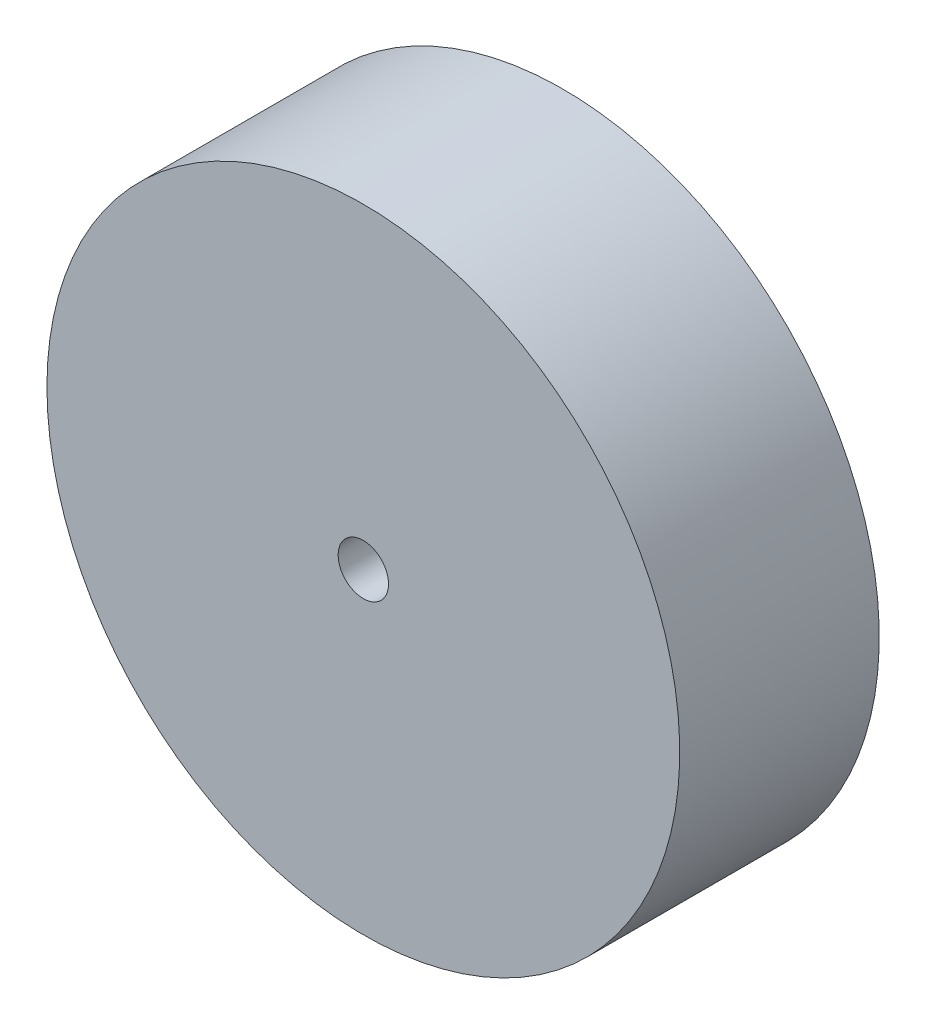
ISO-10303-21;
HEADER;
FILE_DESCRIPTION(('STEP AP214'),'2;1');
FILE_NAME('part.step','',(''),(''),'','','');
FILE_SCHEMA(('AUTOMOTIVE_DESIGN { 1 0 10303 214 1 1 1 1 }'));
ENDSEC;
DATA;
#1=APPLICATION_CONTEXT('core data for automotive mechanical design processes');
#2=APPLICATION_PROTOCOL_DEFINITION('international standard','automotive_design',2000,#1);
#3=PRODUCT_CONTEXT('',#1,'mechanical');
#4=PRODUCT('Part','Part','',(#3));
#5=PRODUCT_RELATED_PRODUCT_CATEGORY('part','',(#4));
#6=PRODUCT_DEFINITION_FORMATION('','',#4);
#7=PRODUCT_DEFINITION_CONTEXT('part definition',#1,'design');
#8=PRODUCT_DEFINITION('design','',#6,#7);
#9=PRODUCT_DEFINITION_SHAPE('','',#8);
#10=(LENGTH_UNIT() NAMED_UNIT(*) SI_UNIT(.MILLI.,.METRE.));
#11=(NAMED_UNIT(*) PLANE_ANGLE_UNIT() SI_UNIT($,.RADIAN.));
#12=(NAMED_UNIT(*) SI_UNIT($,.STERADIAN.) SOLID_ANGLE_UNIT());
#13=UNCERTAINTY_MEASURE_WITH_UNIT(LENGTH_MEASURE(1.E-05),#10,'distance_accuracy_value','');
#14=(GEOMETRIC_REPRESENTATION_CONTEXT(3) GLOBAL_UNCERTAINTY_ASSIGNED_CONTEXT((#13)) GLOBAL_UNIT_ASSIGNED_CONTEXT((#10,
#11,#12)) REPRESENTATION_CONTEXT('',''));
#15=CARTESIAN_POINT('',(0.,0.,0.));
#16=DIRECTION('',(0.,0.,1.));
#17=DIRECTION('',(1.,0.,0.));
#18=AXIS2_PLACEMENT_3D('',#15,#16,#17);
#19=CARTESIAN_POINT('',(0.,0.,19.8));
#20=DIRECTION('',(0.,0.,1.));
#21=DIRECTION('',(1.,0.,0.));
#22=AXIS2_PLACEMENT_3D('',#19,#20,#21);
#23=PLANE('',#22);
#24=CARTESIAN_POINT('',(0.,0.,19.8));
#25=DIRECTION('',(0.,0.,1.));
#26=DIRECTION('',(1.,0.,0.));
#27=AXIS2_PLACEMENT_3D('',#24,#25,#26);
#28=CIRCLE('',#27,31.4);
#29=CARTESIAN_POINT('',(-31.4,0.,19.8));
#30=VERTEX_POINT('',#29);
#31=EDGE_CURVE('E10',#30,#30,#28,.T.);
#32=ORIENTED_EDGE('',*,*,#31,.T.);
#33=EDGE_LOOP('',(#32));
#34=FACE_BOUND('',#33,.T.);
#35=CARTESIAN_POINT('',(0.,0.,19.8));
#36=DIRECTION('',(0.,0.,1.));
#37=DIRECTION('',(1.,0.,0.));
#38=AXIS2_PLACEMENT_3D('',#35,#36,#37);
#39=CIRCLE('',#38,2.5);
#40=CARTESIAN_POINT('',(-2.5,0.,19.8));
#41=VERTEX_POINT('',#40);
#42=EDGE_CURVE('E46',#41,#41,#39,.T.);
#43=ORIENTED_EDGE('',*,*,#42,.F.);
#44=EDGE_LOOP('',(#43));
#45=FACE_BOUND('',#44,.T.);
#46=ADVANCED_FACE('F34',(#34,#45),#23,.T.);
#47=CARTESIAN_POINT('',(0.,0.,0.));
#48=DIRECTION('',(0.,0.,1.));
#49=DIRECTION('',(1.,0.,0.));
#50=AXIS2_PLACEMENT_3D('',#47,#48,#49);
#51=PLANE('',#50);
#52=CARTESIAN_POINT('',(0.,0.,0.));
#53=DIRECTION('',(0.,0.,1.));
#54=DIRECTION('',(1.,0.,0.));
#55=AXIS2_PLACEMENT_3D('',#52,#53,#54);
#56=CIRCLE('',#55,31.4);
#57=CARTESIAN_POINT('',(-31.4,0.,0.));
#58=VERTEX_POINT('',#57);
#59=EDGE_CURVE('E39',#58,#58,#56,.T.);
#60=ORIENTED_EDGE('',*,*,#59,.F.);
#61=EDGE_LOOP('',(#60));
#62=FACE_BOUND('',#61,.T.);
#63=CARTESIAN_POINT('',(0.,0.,0.));
#64=DIRECTION('',(0.,0.,1.));
#65=DIRECTION('',(1.,0.,0.));
#66=AXIS2_PLACEMENT_3D('',#63,#64,#65);
#67=CIRCLE('',#66,2.5);
#68=CARTESIAN_POINT('',(-2.5,0.,0.));
#69=VERTEX_POINT('',#68);
#70=EDGE_CURVE('E48',#69,#69,#67,.T.);
#71=ORIENTED_EDGE('',*,*,#70,.T.);
#72=EDGE_LOOP('',(#71));
#73=FACE_BOUND('',#72,.T.);
#74=ADVANCED_FACE('F59',(#62,#73),#51,.F.);
#75=CARTESIAN_POINT('',(0.,0.,19.8));
#76=DIRECTION('',(0.,0.,-1.));
#77=DIRECTION('',(-1.,0.,0.));
#78=AXIS2_PLACEMENT_3D('',#75,#76,#77);
#79=CYLINDRICAL_SURFACE('',#78,31.4);
#80=CARTESIAN_POINT('',(-31.4,0.,19.8));
#81=CARTESIAN_POINT('',(-31.4,0.,19.59375));
#82=CARTESIAN_POINT('',(-31.4,0.,19.3875));
#83=CARTESIAN_POINT('',(-31.4,0.,18.975));
#84=CARTESIAN_POINT('',(-31.4,0.,18.76875));
#85=CARTESIAN_POINT('',(-31.4,0.,18.35625));
#86=CARTESIAN_POINT('',(-31.4,0.,18.15));
#87=CARTESIAN_POINT('',(-31.4,0.,17.7375));
#88=CARTESIAN_POINT('',(-31.4,0.,17.53125));
#89=CARTESIAN_POINT('',(-31.4,0.,17.11875));
#90=CARTESIAN_POINT('',(-31.4,0.,16.9125));
#91=CARTESIAN_POINT('',(-31.4,0.,16.5));
#92=CARTESIAN_POINT('',(-31.4,0.,16.29375));
#93=CARTESIAN_POINT('',(-31.4,0.,15.88125));
#94=CARTESIAN_POINT('',(-31.4,0.,15.675));
#95=CARTESIAN_POINT('',(-31.4,0.,15.2625));
#96=CARTESIAN_POINT('',(-31.4,0.,15.05625));
#97=CARTESIAN_POINT('',(-31.4,0.,14.64375));
#98=CARTESIAN_POINT('',(-31.4,0.,14.4375));
#99=CARTESIAN_POINT('',(-31.4,0.,14.025));
#100=CARTESIAN_POINT('',(-31.4,0.,13.81875));
#101=CARTESIAN_POINT('',(-31.4,0.,13.40625));
#102=CARTESIAN_POINT('',(-31.4,0.,13.2));
#103=CARTESIAN_POINT('',(-31.4,0.,12.7875));
#104=CARTESIAN_POINT('',(-31.4,0.,12.58125));
#105=CARTESIAN_POINT('',(-31.4,0.,12.16875));
#106=CARTESIAN_POINT('',(-31.4,0.,11.9625));
#107=CARTESIAN_POINT('',(-31.4,0.,11.55));
#108=CARTESIAN_POINT('',(-31.4,0.,11.34375));
#109=CARTESIAN_POINT('',(-31.4,0.,10.93125));
#110=CARTESIAN_POINT('',(-31.4,0.,10.725));
#111=CARTESIAN_POINT('',(-31.4,0.,10.3125));
#112=CARTESIAN_POINT('',(-31.4,0.,10.10625));
#113=CARTESIAN_POINT('',(-31.4,0.,9.69375));
#114=CARTESIAN_POINT('',(-31.4,0.,9.4875));
#115=CARTESIAN_POINT('',(-31.4,0.,9.075));
#116=CARTESIAN_POINT('',(-31.4,0.,8.86875));
#117=CARTESIAN_POINT('',(-31.4,0.,8.45625));
#118=CARTESIAN_POINT('',(-31.4,0.,8.25));
#119=CARTESIAN_POINT('',(-31.4,0.,7.8375));
#120=CARTESIAN_POINT('',(-31.4,0.,7.63125));
#121=CARTESIAN_POINT('',(-31.4,0.,7.21875));
#122=CARTESIAN_POINT('',(-31.4,0.,7.0125));
#123=CARTESIAN_POINT('',(-31.4,0.,6.6));
#124=CARTESIAN_POINT('',(-31.4,0.,6.39375));
#125=CARTESIAN_POINT('',(-31.4,0.,5.98125));
#126=CARTESIAN_POINT('',(-31.4,0.,5.775));
#127=CARTESIAN_POINT('',(-31.4,0.,5.3625));
#128=CARTESIAN_POINT('',(-31.4,0.,5.15625));
#129=CARTESIAN_POINT('',(-31.4,0.,4.74375));
#130=CARTESIAN_POINT('',(-31.4,0.,4.5375));
#131=CARTESIAN_POINT('',(-31.4,0.,4.125));
#132=CARTESIAN_POINT('',(-31.4,0.,3.91875));
#133=CARTESIAN_POINT('',(-31.4,0.,3.50625));
#134=CARTESIAN_POINT('',(-31.4,0.,3.3));
#135=CARTESIAN_POINT('',(-31.4,0.,2.8875));
#136=CARTESIAN_POINT('',(-31.4,0.,2.68125));
#137=CARTESIAN_POINT('',(-31.4,0.,2.26875));
#138=CARTESIAN_POINT('',(-31.4,0.,2.0625));
#139=CARTESIAN_POINT('',(-31.4,0.,1.65));
#140=CARTESIAN_POINT('',(-31.4,0.,1.44375));
#141=CARTESIAN_POINT('',(-31.4,0.,1.03125));
#142=CARTESIAN_POINT('',(-31.4,0.,0.825));
#143=CARTESIAN_POINT('',(-31.4,0.,0.412500000000001));
#144=CARTESIAN_POINT('',(-31.4,0.,0.206250000000001));
#145=CARTESIAN_POINT('',(-31.4,0.,0.));
#146=B_SPLINE_CURVE_WITH_KNOTS('',3,(#80,#81,#82,#83,#84,#85,#86,#87,#88,#89,#90,#91,#92,#93,
#94,#95,#96,#97,#98,#99,#100,#101,#102,#103,#104,#105,#106,#107,#108,#109,#110,#111,#112,#113,
#114,#115,#116,#117,#118,#119,#120,#121,#122,#123,#124,#125,#126,#127,#128,#129,#130,#131,#132,
#133,#134,#135,#136,#137,#138,#139,#140,#141,#142,#143,#144,#145),.UNSPECIFIED.,.F.,.F.,(4,2,2,
2,2,2,2,2,2,2,2,2,2,2,2,2,2,2,2,2,2,2,2,2,2,2,2,2,2,2,2,2,4),(0.,0.618750000000001,1.2375,
1.85625,2.475,3.09375,3.7125,4.33125,4.95,5.56875,6.1875,6.80625,7.425,8.04375,8.6625,9.28125,
9.9,10.51875,11.1375,11.75625,12.375,12.99375,13.6125,14.23125,14.85,15.46875,16.0875,16.70625,
17.325,17.94375,18.5625,19.18125,19.8),.UNSPECIFIED.);
#147=EDGE_CURVE('BSEAM40',#30,#58,#146,.T.);
#148=ORIENTED_EDGE('',*,*,#31,.F.);
#149=ORIENTED_EDGE('',*,*,#59,.T.);
#150=ORIENTED_EDGE('',*,*,#147,.T.);
#151=ORIENTED_EDGE('',*,*,#147,.F.);
#152=EDGE_LOOP('',(#148,#150,#149,#151));
#153=FACE_BOUND('',#152,.T.);
#154=ADVANCED_FACE('F40',(#153),#79,.T.);
#155=CARTESIAN_POINT('',(0.,0.,19.8));
#156=DIRECTION('',(0.,0.,-1.));
#157=DIRECTION('',(-1.,0.,0.));
#158=AXIS2_PLACEMENT_3D('',#155,#156,#157);
#159=CYLINDRICAL_SURFACE('',#158,2.5);
#160=CARTESIAN_POINT('',(-2.5,0.,19.8));
#161=CARTESIAN_POINT('',(-2.5,0.,19.59375));
#162=CARTESIAN_POINT('',(-2.5,0.,19.3875));
#163=CARTESIAN_POINT('',(-2.5,0.,18.975));
#164=CARTESIAN_POINT('',(-2.5,0.,18.76875));
#165=CARTESIAN_POINT('',(-2.5,0.,18.35625));
#166=CARTESIAN_POINT('',(-2.5,0.,18.15));
#167=CARTESIAN_POINT('',(-2.5,0.,17.7375));
#168=CARTESIAN_POINT('',(-2.5,0.,17.53125));
#169=CARTESIAN_POINT('',(-2.5,0.,17.11875));
#170=CARTESIAN_POINT('',(-2.5,0.,16.9125));
#171=CARTESIAN_POINT('',(-2.5,0.,16.5));
#172=CARTESIAN_POINT('',(-2.5,0.,16.29375));
#173=CARTESIAN_POINT('',(-2.5,0.,15.88125));
#174=CARTESIAN_POINT('',(-2.5,0.,15.675));
#175=CARTESIAN_POINT('',(-2.5,0.,15.2625));
#176=CARTESIAN_POINT('',(-2.5,0.,15.05625));
#177=CARTESIAN_POINT('',(-2.5,0.,14.64375));
#178=CARTESIAN_POINT('',(-2.5,0.,14.4375));
#179=CARTESIAN_POINT('',(-2.5,0.,14.025));
#180=CARTESIAN_POINT('',(-2.5,0.,13.81875));
#181=CARTESIAN_POINT('',(-2.5,0.,13.40625));
#182=CARTESIAN_POINT('',(-2.5,0.,13.2));
#183=CARTESIAN_POINT('',(-2.5,0.,12.7875));
#184=CARTESIAN_POINT('',(-2.5,0.,12.58125));
#185=CARTESIAN_POINT('',(-2.5,0.,12.16875));
#186=CARTESIAN_POINT('',(-2.5,0.,11.9625));
#187=CARTESIAN_POINT('',(-2.5,0.,11.55));
#188=CARTESIAN_POINT('',(-2.5,0.,11.34375));
#189=CARTESIAN_POINT('',(-2.5,0.,10.93125));
#190=CARTESIAN_POINT('',(-2.5,0.,10.725));
#191=CARTESIAN_POINT('',(-2.5,0.,10.3125));
#192=CARTESIAN_POINT('',(-2.5,0.,10.10625));
#193=CARTESIAN_POINT('',(-2.5,0.,9.69375));
#194=CARTESIAN_POINT('',(-2.5,0.,9.4875));
#195=CARTESIAN_POINT('',(-2.5,0.,9.075));
#196=CARTESIAN_POINT('',(-2.5,0.,8.86875));
#197=CARTESIAN_POINT('',(-2.5,0.,8.45625));
#198=CARTESIAN_POINT('',(-2.5,0.,8.25));
#199=CARTESIAN_POINT('',(-2.5,0.,7.8375));
#200=CARTESIAN_POINT('',(-2.5,0.,7.63125));
#201=CARTESIAN_POINT('',(-2.5,0.,7.21875));
#202=CARTESIAN_POINT('',(-2.5,0.,7.0125));
#203=CARTESIAN_POINT('',(-2.5,0.,6.6));
#204=CARTESIAN_POINT('',(-2.5,0.,6.39375));
#205=CARTESIAN_POINT('',(-2.5,0.,5.98125));
#206=CARTESIAN_POINT('',(-2.5,0.,5.775));
#207=CARTESIAN_POINT('',(-2.5,0.,5.3625));
#208=CARTESIAN_POINT('',(-2.5,0.,5.15625));
#209=CARTESIAN_POINT('',(-2.5,0.,4.74375));
#210=CARTESIAN_POINT('',(-2.5,0.,4.5375));
#211=CARTESIAN_POINT('',(-2.5,0.,4.125));
#212=CARTESIAN_POINT('',(-2.5,0.,3.91875));
#213=CARTESIAN_POINT('',(-2.5,0.,3.50625));
#214=CARTESIAN_POINT('',(-2.5,0.,3.3));
#215=CARTESIAN_POINT('',(-2.5,0.,2.8875));
#216=CARTESIAN_POINT('',(-2.5,0.,2.68125));
#217=CARTESIAN_POINT('',(-2.5,0.,2.26875));
#218=CARTESIAN_POINT('',(-2.5,0.,2.0625));
#219=CARTESIAN_POINT('',(-2.5,0.,1.65));
#220=CARTESIAN_POINT('',(-2.5,0.,1.44375));
#221=CARTESIAN_POINT('',(-2.5,0.,1.03125));
#222=CARTESIAN_POINT('',(-2.5,0.,0.825));
#223=CARTESIAN_POINT('',(-2.5,0.,0.412500000000001));
#224=CARTESIAN_POINT('',(-2.5,0.,0.206250000000001));
#225=CARTESIAN_POINT('',(-2.5,0.,0.));
#226=B_SPLINE_CURVE_WITH_KNOTS('',3,(#160,#161,#162,#163,#164,#165,#166,#167,#168,#169,#170,
#171,#172,#173,#174,#175,#176,#177,#178,#179,#180,#181,#182,#183,#184,#185,#186,#187,#188,#189,
#190,#191,#192,#193,#194,#195,#196,#197,#198,#199,#200,#201,#202,#203,#204,#205,#206,#207,#208,
#209,#210,#211,#212,#213,#214,#215,#216,#217,#218,#219,#220,#221,#222,#223,#224,#225),
.UNSPECIFIED.,.F.,.F.,(4,2,2,2,2,2,2,2,2,2,2,2,2,2,2,2,2,2,2,2,2,2,2,2,2,2,2,2,2,2,2,2,4),(0.,
0.618750000000001,1.2375,1.85625,2.475,3.09375,3.7125,4.33125,4.95,5.56875,6.1875,6.80625,7.425,
8.04375,8.6625,9.28125,9.9,10.51875,11.1375,11.75625,12.375,12.99375,13.6125,14.23125,14.85,
15.46875,16.0875,16.70625,17.325,17.94375,18.5625,19.18125,19.8),.UNSPECIFIED.);
#227=EDGE_CURVE('BSEAM53',#41,#69,#226,.T.);
#228=ORIENTED_EDGE('',*,*,#42,.T.);
#229=ORIENTED_EDGE('',*,*,#70,.F.);
#230=ORIENTED_EDGE('',*,*,#227,.T.);
#231=ORIENTED_EDGE('',*,*,#227,.F.);
#232=EDGE_LOOP('',(#228,#230,#229,#231));
#233=FACE_BOUND('',#232,.T.);
#234=ADVANCED_FACE('F53',(#233),#159,.F.);
#235=CLOSED_SHELL('',(#46,#74,#154,#234));
#236=MANIFOLD_SOLID_BREP('B2',#235);
#237=ADVANCED_BREP_SHAPE_REPRESENTATION('',(#18,#236),#14);
#238=SHAPE_DEFINITION_REPRESENTATION(#9,#237);
ENDSEC;
END-ISO-10303-21;
